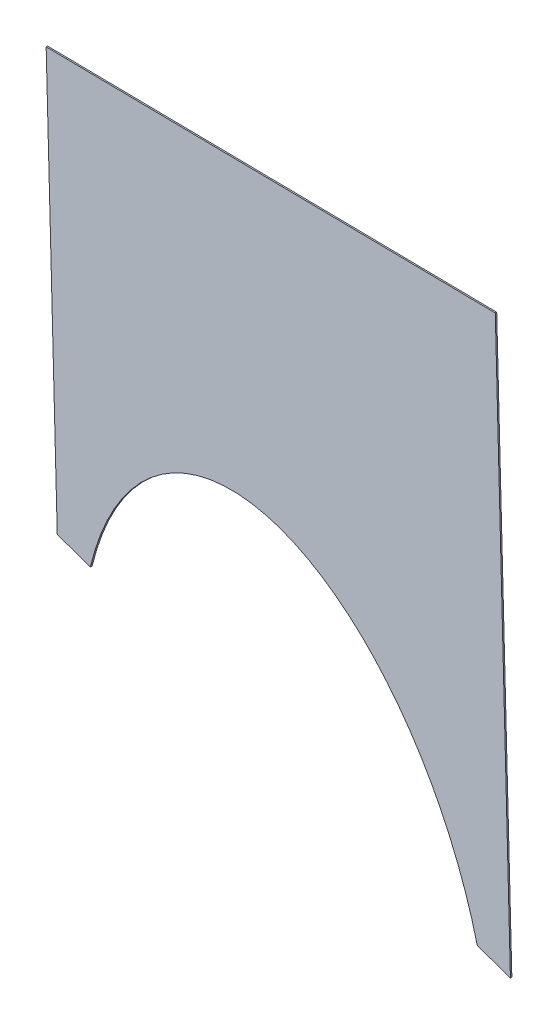
ISO-10303-21;
HEADER;
FILE_DESCRIPTION(('STEP AP214'),'2;1');
FILE_NAME('part.step','',(''),(''),'','','');
FILE_SCHEMA(('AUTOMOTIVE_DESIGN { 1 0 10303 214 1 1 1 1 }'));
ENDSEC;
DATA;
#1=APPLICATION_CONTEXT('core data for automotive mechanical design processes');
#2=APPLICATION_PROTOCOL_DEFINITION('international standard','automotive_design',2000,#1);
#3=PRODUCT_CONTEXT('',#1,'mechanical');
#4=PRODUCT('Part','Part','',(#3));
#5=PRODUCT_RELATED_PRODUCT_CATEGORY('part','',(#4));
#6=PRODUCT_DEFINITION_FORMATION('','',#4);
#7=PRODUCT_DEFINITION_CONTEXT('part definition',#1,'design');
#8=PRODUCT_DEFINITION('design','',#6,#7);
#9=PRODUCT_DEFINITION_SHAPE('','',#8);
#10=(LENGTH_UNIT() NAMED_UNIT(*) SI_UNIT(.MILLI.,.METRE.));
#11=(NAMED_UNIT(*) PLANE_ANGLE_UNIT() SI_UNIT($,.RADIAN.));
#12=(NAMED_UNIT(*) SI_UNIT($,.STERADIAN.) SOLID_ANGLE_UNIT());
#13=UNCERTAINTY_MEASURE_WITH_UNIT(LENGTH_MEASURE(1.E-05),#10,'distance_accuracy_value','');
#14=(GEOMETRIC_REPRESENTATION_CONTEXT(3) GLOBAL_UNCERTAINTY_ASSIGNED_CONTEXT((#13)) GLOBAL_UNIT_ASSIGNED_CONTEXT((#10,
#11,#12)) REPRESENTATION_CONTEXT('',''));
#15=CARTESIAN_POINT('',(0.,0.,0.));
#16=DIRECTION('',(0.,0.,1.));
#17=DIRECTION('',(1.,0.,0.));
#18=AXIS2_PLACEMENT_3D('',#15,#16,#17);
#19=CARTESIAN_POINT('',(0.0551750725104067,-81.6086535482553,-5.52132124742588E-11));
#20=DIRECTION('',(0.0238196702528549,-0.999716271403564,0.));
#21=DIRECTION('',(0.999716271403565,0.0238196702528549,0.));
#22=AXIS2_PLACEMENT_3D('',#19,#20,#21);
#23=PLANE('',#22);
#24=DIRECTION('',(-0.26550410096788,-0.00632601500719441,0.964088976134136));
#25=VECTOR('',#24,1.);
#26=CARTESIAN_POINT('',(612.432203086897,-67.0178948550443,168.740559908771));
#27=LINE('',#26,#25);
#28=CARTESIAN_POINT('',(612.42404615515,-67.0180892056116,168.770179066995));
#29=VERTEX_POINT('',#28);
#30=CARTESIAN_POINT('',(612.040096904174,-67.0272373457527,170.164361826928));
#31=VERTEX_POINT('',#30);
#32=EDGE_CURVE('E138',#29,#31,#27,.T.);
#33=ORIENTED_EDGE('',*,*,#32,.F.);
#34=DIRECTION('',(0.963802597264003,0.0229639755922371,0.265626070505439));
#35=VECTOR('',#34,1.);
#36=CARTESIAN_POINT('',(0.0551750725104067,-81.6086535482553,-5.52132124742588E-11));
#37=LINE('',#36,#35);
#38=CARTESIAN_POINT('',(660.245188025042,-65.8786820927749,181.94978870702));
#39=VERTEX_POINT('',#38);
#40=EDGE_CURVE('E80',#29,#39,#37,.T.);
#41=ORIENTED_EDGE('',*,*,#40,.T.);
#42=DIRECTION('',(0.,0.,1.));
#43=VECTOR('',#42,1.);
#44=CARTESIAN_POINT('',(660.245188025042,-65.8786820927749,181.94978870702));
#45=LINE('',#44,#43);
#46=CARTESIAN_POINT('',(660.245188025042,-65.8786820927749,183.44978870702));
#47=VERTEX_POINT('',#46);
#48=EDGE_CURVE('E182',#39,#47,#45,.T.);
#49=ORIENTED_EDGE('',*,*,#48,.T.);
#50=DIRECTION('',(0.963802597264003,0.0229639755922371,0.265626070505439));
#51=VECTOR('',#50,1.);
#52=CARTESIAN_POINT('',(0.0551750725104068,-81.6086535482553,1.49999999994479));
#53=LINE('',#52,#51);
#54=EDGE_CURVE('E177',#31,#47,#53,.T.);
#55=ORIENTED_EDGE('',*,*,#54,.F.);
#56=EDGE_LOOP('',(#33,#41,#49,#55));
#57=FACE_BOUND('',#56,.T.);
#58=ADVANCED_FACE('F76',(#57),#23,.T.);
#59=CARTESIAN_POINT('',(-0.14941973707434,-0.00398112531200438,2.04250154310926));
#60=DIRECTION('',(0.265532815319549,0.00707483116310519,-0.964075863587761));
#61=DIRECTION('',(-0.9640999920519,0.,-0.265539460957361));
#62=AXIS2_PLACEMENT_3D('',#59,#60,#61);
#63=PLANE('',#62);
#64=CARTESIAN_POINT('',(332.628710638816,-176.907343018782,92.400486539976));
#65=DIRECTION('',(-0.26553281531955,-0.00707483116310519,0.964075863587761));
#66=DIRECTION('',(0.9640999920519,0.,0.265539460957361));
#67=AXIS2_PLACEMENT_3D('',#64,#65,#66);
#68=CIRCLE('',#67,310.147675627417);
#69=CARTESIAN_POINT('',(48.2602661933784,-80.4600982952775,14.7854268800358));
#70=VERTEX_POINT('',#69);
#71=EDGE_CURVE('E157',#70,#31,#68,.F.);
#72=ORIENTED_EDGE('',*,*,#71,.T.);
#73=ORIENTED_EDGE('',*,*,#54,.T.);
#74=DIRECTION('',(0.026634453024939,-0.999645240028712,0.));
#75=VECTOR('',#74,1.);
#76=CARTESIAN_POINT('',(644.264516210078,533.908461924453,183.449788707018));
#77=LINE('',#76,#75);
#78=CARTESIAN_POINT('',(644.264516210078,533.908461924453,183.449788707018));
#79=VERTEX_POINT('',#78);
#80=EDGE_CURVE('E197',#79,#47,#77,.T.);
#81=ORIENTED_EDGE('',*,*,#80,.F.);
#82=DIRECTION('',(0.933041963682136,0.249890767937517,0.258819045102525));
#83=VECTOR('',#82,1.);
#84=CARTESIAN_POINT('',(-11.6639842584627,358.235252064378,1.49999999994316));
#85=LINE('',#84,#83);
#86=CARTESIAN_POINT('',(-11.6639842584627,358.235252064378,1.49999999994316));
#87=VERTEX_POINT('',#86);
#88=EDGE_CURVE('E120',#87,#79,#85,.T.);
#89=ORIENTED_EDGE('',*,*,#88,.F.);
#90=DIRECTION('',(0.0266344530249388,-0.999645240028713,0.));
#91=VECTOR('',#90,1.);
#92=CARTESIAN_POINT('',(-11.6639842584627,358.235252064378,1.49999999994316));
#93=LINE('',#92,#91);
#94=CARTESIAN_POINT('',(0.0551750725104074,-81.6086535482553,1.49999999994479));
#95=VERTEX_POINT('',#94);
#96=EDGE_CURVE('E88',#87,#95,#93,.T.);
#97=ORIENTED_EDGE('',*,*,#96,.T.);
#98=EDGE_CURVE('E164',#95,#70,#53,.T.);
#99=ORIENTED_EDGE('',*,*,#98,.T.);
#100=EDGE_LOOP('',(#72,#73,#81,#89,#97,#99));
#101=FACE_BOUND('',#100,.T.);
#102=ADVANCED_FACE('F78',(#101),#63,.F.);
#103=CARTESIAN_POINT('',(-0.14941973707434,-0.0039811253120047,0.542501543109257));
#104=DIRECTION('',(0.265532815319549,0.00707483116310519,-0.964075863587761));
#105=DIRECTION('',(-0.9640999920519,0.,-0.265539460957361));
#106=AXIS2_PLACEMENT_3D('',#103,#104,#105);
#107=PLANE('',#106);
#108=DIRECTION('',(-0.0382128002292534,-0.999110062717797,-0.0178567767158273));
#109=VECTOR('',#108,1.);
#110=CARTESIAN_POINT('',(613.973281660374,-26.5118511518236,169.494134190173));
#111=LINE('',#110,#109);
#112=CARTESIAN_POINT('',(612.424087571534,-67.0170063348077,168.7701984208));
#113=VERTEX_POINT('',#112);
#114=EDGE_CURVE('E173',#113,#29,#111,.T.);
#115=ORIENTED_EDGE('',*,*,#114,.F.);
#116=CARTESIAN_POINT('',(333.012701306176,-176.897112007837,91.0063231338473));
#117=DIRECTION('',(0.265532815319549,0.00707483116310519,-0.964075863587761));
#118=DIRECTION('',(-0.9640999920519,0.,-0.265539460957361));
#119=AXIS2_PLACEMENT_3D('',#116,#117,#118);
#120=CIRCLE('',#119,310.147675627417);
#121=CARTESIAN_POINT('',(48.6442568607385,-80.4498672843326,13.391263473907));
#122=VERTEX_POINT('',#121);
#123=EDGE_CURVE('E222',#113,#122,#120,.F.);
#124=ORIENTED_EDGE('',*,*,#123,.T.);
#125=DIRECTION('',(0.,0.999973074597522,0.00733826137302197));
#126=VECTOR('',#125,1.);
#127=CARTESIAN_POINT('',(48.6442568607386,-0.102598177352738,13.9808886111167));
#128=LINE('',#127,#126);
#129=CARTESIAN_POINT('',(48.6442568607385,-80.4509491683319,13.3912555345458));
#130=VERTEX_POINT('',#129);
#131=EDGE_CURVE('E130',#130,#122,#128,.T.);
#132=ORIENTED_EDGE('',*,*,#131,.F.);
#133=CARTESIAN_POINT('',(0.0551750725104073,-81.6086535482553,-5.52132124742588E-11));
#134=VERTEX_POINT('',#133);
#135=EDGE_CURVE('E165',#134,#130,#37,.T.);
#136=ORIENTED_EDGE('',*,*,#135,.F.);
#137=DIRECTION('',(0.0266344530249388,-0.999645240028713,0.));
#138=VECTOR('',#137,1.);
#139=CARTESIAN_POINT('',(-11.6639842584627,358.235252064378,-5.6843418860808E-11));
#140=LINE('',#139,#138);
#141=CARTESIAN_POINT('',(-11.6639842584627,358.235252064378,-5.6843418860808E-11));
#142=VERTEX_POINT('',#141);
#143=EDGE_CURVE('E12',#142,#134,#140,.T.);
#144=ORIENTED_EDGE('',*,*,#143,.F.);
#145=DIRECTION('',(0.933041963682136,0.249890767937517,0.258819045102525));
#146=VECTOR('',#145,1.);
#147=CARTESIAN_POINT('',(-11.6639842584627,358.235252064378,-5.6843418860808E-11));
#148=LINE('',#147,#146);
#149=CARTESIAN_POINT('',(644.264516210078,533.908461924453,181.949788707018));
#150=VERTEX_POINT('',#149);
#151=EDGE_CURVE('E198',#142,#150,#148,.T.);
#152=ORIENTED_EDGE('',*,*,#151,.T.);
#153=DIRECTION('',(0.026634453024939,-0.999645240028712,0.));
#154=VECTOR('',#153,1.);
#155=CARTESIAN_POINT('',(644.264516210078,533.908461924453,181.949788707018));
#156=LINE('',#155,#154);
#157=EDGE_CURVE('E204',#150,#39,#156,.T.);
#158=ORIENTED_EDGE('',*,*,#157,.T.);
#159=ORIENTED_EDGE('',*,*,#40,.F.);
#160=EDGE_LOOP('',(#115,#124,#132,#136,#144,#152,#158,#159));
#161=FACE_BOUND('',#160,.T.);
#162=ADVANCED_FACE('F255',(#161),#107,.T.);
#163=CARTESIAN_POINT('',(-11.6639842584627,358.235252064378,-5.6843418860808E-11));
#164=DIRECTION('',(0.258705959750095,-0.965956120323166,0.));
#165=DIRECTION('',(0.965956120323166,0.258705959750095,0.));
#166=AXIS2_PLACEMENT_3D('',#163,#164,#165);
#167=PLANE('',#166);
#168=ORIENTED_EDGE('',*,*,#88,.T.);
#169=DIRECTION('',(0.,0.,1.));
#170=VECTOR('',#169,1.);
#171=CARTESIAN_POINT('',(644.264516210078,533.908461924453,181.949788707018));
#172=LINE('',#171,#170);
#173=EDGE_CURVE('E194',#150,#79,#172,.T.);
#174=ORIENTED_EDGE('',*,*,#173,.F.);
#175=ORIENTED_EDGE('',*,*,#151,.F.);
#176=DIRECTION('',(0.,0.,1.));
#177=VECTOR('',#176,1.);
#178=CARTESIAN_POINT('',(-11.6639842584627,358.235252064378,-5.6843418860808E-11));
#179=LINE('',#178,#177);
#180=EDGE_CURVE('E221',#142,#87,#179,.T.);
#181=ORIENTED_EDGE('',*,*,#180,.T.);
#182=EDGE_LOOP('',(#168,#174,#175,#181));
#183=FACE_BOUND('',#182,.T.);
#184=ADVANCED_FACE('F258',(#183),#167,.F.);
#185=CARTESIAN_POINT('',(644.264516210078,533.908461924453,181.949788707018));
#186=DIRECTION('',(-0.999645240028713,-0.0266344530249391,0.));
#187=DIRECTION('',(0.0266344530249391,-0.999645240028713,0.));
#188=AXIS2_PLACEMENT_3D('',#185,#186,#187);
#189=PLANE('',#188);
#190=ORIENTED_EDGE('',*,*,#80,.T.);
#191=ORIENTED_EDGE('',*,*,#48,.F.);
#192=ORIENTED_EDGE('',*,*,#157,.F.);
#193=ORIENTED_EDGE('',*,*,#173,.T.);
#194=EDGE_LOOP('',(#190,#191,#192,#193));
#195=FACE_BOUND('',#194,.T.);
#196=ADVANCED_FACE('F218',(#195),#189,.F.);
#197=CARTESIAN_POINT('',(-11.6639842584627,358.235252064378,-5.6843418860808E-11));
#198=DIRECTION('',(-0.999645240028712,-0.0266344530249388,0.));
#199=DIRECTION('',(0.0266344530249388,-0.999645240028713,0.));
#200=AXIS2_PLACEMENT_3D('',#197,#198,#199);
#201=PLANE('',#200);
#202=ORIENTED_EDGE('',*,*,#96,.F.);
#203=ORIENTED_EDGE('',*,*,#180,.F.);
#204=ORIENTED_EDGE('',*,*,#143,.T.);
#205=DIRECTION('',(0.,0.,1.));
#206=VECTOR('',#205,1.);
#207=CARTESIAN_POINT('',(0.0551750725104067,-81.6086535482553,-5.52132124742588E-11));
#208=LINE('',#207,#206);
#209=EDGE_CURVE('E176',#134,#95,#208,.T.);
#210=ORIENTED_EDGE('',*,*,#209,.T.);
#211=EDGE_LOOP('',(#202,#203,#204,#210));
#212=FACE_BOUND('',#211,.T.);
#213=ADVANCED_FACE('F266',(#212),#201,.T.);
#214=DIRECTION('',(0.265532741006024,0.00632669739707255,-0.964081083910411));
#215=VECTOR('',#214,1.);
#216=CARTESIAN_POINT('',(48.6445063646589,-80.4509432235441,13.3903496499867));
#217=LINE('',#216,#215);
#218=EDGE_CURVE('E150',#70,#130,#217,.T.);
#219=ORIENTED_EDGE('',*,*,#218,.F.);
#220=ORIENTED_EDGE('',*,*,#98,.F.);
#221=ORIENTED_EDGE('',*,*,#209,.F.);
#222=ORIENTED_EDGE('',*,*,#135,.T.);
#223=EDGE_LOOP('',(#219,#220,#221,#222));
#224=FACE_BOUND('',#223,.T.);
#225=ADVANCED_FACE('F161',(#224),#23,.T.);
#226=CARTESIAN_POINT('',(335.682338014991,-176.825982460406,81.3136141087167));
#227=DIRECTION('',(-0.265532815319549,-0.00707483116310518,0.964075863587761));
#228=DIRECTION('',(0.9640999920519,0.,0.265539460957361));
#229=AXIS2_PLACEMENT_3D('',#226,#227,#228);
#230=CYLINDRICAL_SURFACE('',#229,310.147675627417);
#231=DIRECTION('',(-0.265532815319549,-0.00707483116310518,0.964075863587761));
#232=VECTOR('',#231,1.);
#233=CARTESIAN_POINT('',(615.093724280349,-66.945876787377,159.077489395669));
#234=LINE('',#233,#232);
#235=EDGE_CURVE('E156',#113,#31,#234,.T.);
#236=ORIENTED_EDGE('',*,*,#235,.T.);
#237=ORIENTED_EDGE('',*,*,#71,.F.);
#238=DIRECTION('',(-0.265532815319549,-0.00707483116310518,0.964075863587761));
#239=VECTOR('',#238,1.);
#240=CARTESIAN_POINT('',(51.3138935695532,-80.3787377369018,3.69855444877648));
#241=LINE('',#240,#239);
#242=EDGE_CURVE('E147',#122,#70,#241,.T.);
#243=ORIENTED_EDGE('',*,*,#242,.F.);
#244=ORIENTED_EDGE('',*,*,#123,.F.);
#245=EDGE_LOOP('',(#236,#237,#243,#244));
#246=FACE_BOUND('',#245,.T.);
#247=ADVANCED_FACE('F169',(#246),#230,.F.);
#248=CARTESIAN_POINT('',(51.3138935695532,-80.3787377369018,3.69855444877651));
#249=DIRECTION('',(-0.96410182241736,0.00194854920193,-0.265525665741626));
#250=DIRECTION('',(-0.265526169822826,0.,0.964103652694678));
#251=AXIS2_PLACEMENT_3D('',#248,#249,#250);
#252=PLANE('',#251);
#253=ORIENTED_EDGE('',*,*,#131,.T.);
#254=ORIENTED_EDGE('',*,*,#242,.T.);
#255=ORIENTED_EDGE('',*,*,#218,.T.);
#256=EDGE_LOOP('',(#253,#254,#255));
#257=FACE_BOUND('',#256,.T.);
#258=ADVANCED_FACE('F149',(#257),#252,.F.);
#259=CARTESIAN_POINT('',(613.547872592313,-107.363641717465,158.35511552452));
#260=DIRECTION('',(0.963344230214264,-0.0415815985750103,0.265026158657657));
#261=DIRECTION('',(0.265255575203614,0.,-0.964178136976461));
#262=AXIS2_PLACEMENT_3D('',#259,#260,#261);
#263=PLANE('',#262);
#264=ORIENTED_EDGE('',*,*,#114,.T.);
#265=ORIENTED_EDGE('',*,*,#32,.T.);
#266=ORIENTED_EDGE('',*,*,#235,.F.);
#267=EDGE_LOOP('',(#264,#265,#266));
#268=FACE_BOUND('',#267,.T.);
#269=ADVANCED_FACE('F254',(#268),#263,.F.);
#270=CLOSED_SHELL('',(#58,#102,#162,#184,#196,#213,#225,#247,#258,#269));
#271=MANIFOLD_SOLID_BREP('B2',#270);
#272=ADVANCED_BREP_SHAPE_REPRESENTATION('',(#18,#271),#14);
#273=SHAPE_DEFINITION_REPRESENTATION(#9,#272);
ENDSEC;
END-ISO-10303-21;
